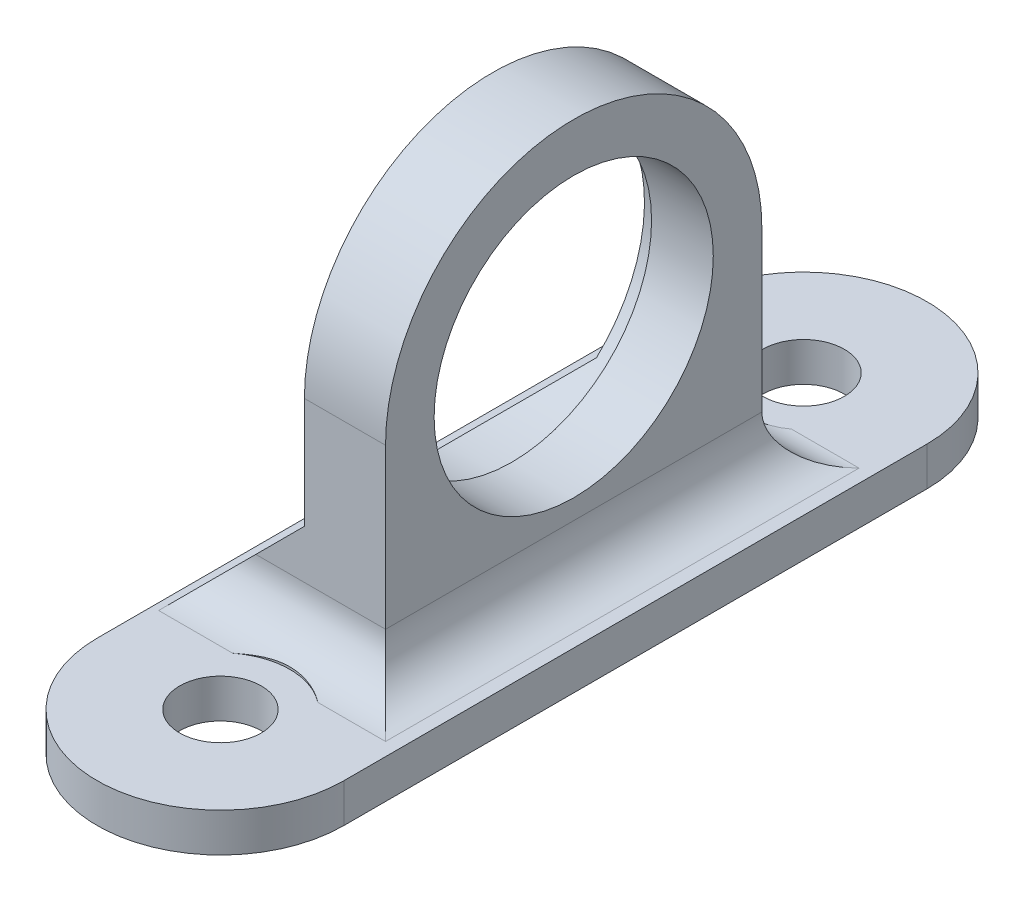
ISO-10303-21;
HEADER;
FILE_DESCRIPTION(('STEP AP214'),'2;1');
FILE_NAME('part.step','',(''),(''),'','','');
FILE_SCHEMA(('AUTOMOTIVE_DESIGN { 1 0 10303 214 1 1 1 1 }'));
ENDSEC;
DATA;
#1=APPLICATION_CONTEXT('core data for automotive mechanical design processes');
#2=APPLICATION_PROTOCOL_DEFINITION('international standard','automotive_design',2000,#1);
#3=PRODUCT_CONTEXT('',#1,'mechanical');
#4=PRODUCT('Part','Part','',(#3));
#5=PRODUCT_RELATED_PRODUCT_CATEGORY('part','',(#4));
#6=PRODUCT_DEFINITION_FORMATION('','',#4);
#7=PRODUCT_DEFINITION_CONTEXT('part definition',#1,'design');
#8=PRODUCT_DEFINITION('design','',#6,#7);
#9=PRODUCT_DEFINITION_SHAPE('','',#8);
#10=(LENGTH_UNIT() NAMED_UNIT(*) SI_UNIT(.MILLI.,.METRE.));
#11=(NAMED_UNIT(*) PLANE_ANGLE_UNIT() SI_UNIT($,.RADIAN.));
#12=(NAMED_UNIT(*) SI_UNIT($,.STERADIAN.) SOLID_ANGLE_UNIT());
#13=UNCERTAINTY_MEASURE_WITH_UNIT(LENGTH_MEASURE(1.E-05),#10,'distance_accuracy_value','');
#14=(GEOMETRIC_REPRESENTATION_CONTEXT(3) GLOBAL_UNCERTAINTY_ASSIGNED_CONTEXT((#13)) GLOBAL_UNIT_ASSIGNED_CONTEXT((#10,
#11,#12)) REPRESENTATION_CONTEXT('',''));
#15=CARTESIAN_POINT('',(0.,0.,0.));
#16=DIRECTION('',(0.,0.,1.));
#17=DIRECTION('',(1.,0.,0.));
#18=AXIS2_PLACEMENT_3D('',#15,#16,#17);
#19=CARTESIAN_POINT('',(0.,-28.4,-30.));
#20=DIRECTION('',(0.,1.,0.));
#21=DIRECTION('',(0.,0.,1.));
#22=AXIS2_PLACEMENT_3D('',#19,#20,#21);
#23=PLANE('',#22);
#24=DIRECTION('',(1.,0.,0.));
#25=VECTOR('',#24,1.);
#26=CARTESIAN_POINT('',(0.,-28.4,24.3637));
#27=LINE('',#26,#25);
#28=CARTESIAN_POINT('',(11.35,-28.4,24.3637));
#29=VERTEX_POINT('',#28);
#30=CARTESIAN_POINT('',(4.38922389181733,-28.4,24.3637));
#31=VERTEX_POINT('',#30);
#32=EDGE_CURVE('E173',#29,#31,#27,.F.);
#33=ORIENTED_EDGE('',*,*,#32,.T.);
#34=CARTESIAN_POINT('',(0.,-28.4,30.));
#35=DIRECTION('',(0.,-1.,0.));
#36=DIRECTION('',(0.,0.,-1.));
#37=AXIS2_PLACEMENT_3D('',#34,#35,#36);
#38=CIRCLE('',#37,7.14374999999999);
#39=CARTESIAN_POINT('',(-4.38922389181729,-28.4,24.3637));
#40=VERTEX_POINT('',#39);
#41=EDGE_CURVE('E81',#40,#31,#38,.T.);
#42=ORIENTED_EDGE('',*,*,#41,.F.);
#43=CARTESIAN_POINT('',(-12.0000000000001,-28.4,24.3637));
#44=VERTEX_POINT('',#43);
#45=EDGE_CURVE('E176',#40,#44,#27,.F.);
#46=ORIENTED_EDGE('',*,*,#45,.T.);
#47=DIRECTION('',(0.,0.,-1.));
#48=VECTOR('',#47,1.);
#49=CARTESIAN_POINT('',(-12.0000000000001,-28.4,-30.));
#50=LINE('',#49,#48);
#51=CARTESIAN_POINT('',(-12.0000000000001,-28.4,-24.3637));
#52=VERTEX_POINT('',#51);
#53=EDGE_CURVE('E321',#44,#52,#50,.T.);
#54=ORIENTED_EDGE('',*,*,#53,.T.);
#55=DIRECTION('',(-1.,0.,0.));
#56=VECTOR('',#55,1.);
#57=CARTESIAN_POINT('',(0.,-28.4,-24.3637));
#58=LINE('',#57,#56);
#59=CARTESIAN_POINT('',(-4.38922389181732,-28.4,-24.3637));
#60=VERTEX_POINT('',#59);
#61=EDGE_CURVE('E338',#52,#60,#58,.F.);
#62=ORIENTED_EDGE('',*,*,#61,.T.);
#63=CARTESIAN_POINT('',(0.,-28.4,-30.));
#64=DIRECTION('',(0.,-1.,0.));
#65=DIRECTION('',(0.,0.,-1.));
#66=AXIS2_PLACEMENT_3D('',#63,#64,#65);
#67=CIRCLE('',#66,7.14374999999999);
#68=CARTESIAN_POINT('',(4.38922389181732,-28.4,-24.3637));
#69=VERTEX_POINT('',#68);
#70=EDGE_CURVE('E88',#69,#60,#67,.T.);
#71=ORIENTED_EDGE('',*,*,#70,.F.);
#72=CARTESIAN_POINT('',(11.35,-28.4,-24.3637));
#73=VERTEX_POINT('',#72);
#74=EDGE_CURVE('E337',#69,#73,#58,.F.);
#75=ORIENTED_EDGE('',*,*,#74,.T.);
#76=DIRECTION('',(0.,0.,-1.));
#77=VECTOR('',#76,1.);
#78=CARTESIAN_POINT('',(11.35,-28.4,-30.));
#79=LINE('',#78,#77);
#80=EDGE_CURVE('E181',#73,#29,#79,.F.);
#81=ORIENTED_EDGE('',*,*,#80,.T.);
#82=EDGE_LOOP('',(#33,#42,#46,#54,#62,#71,#75,#81));
#83=FACE_BOUND('',#82,.T.);
#84=CARTESIAN_POINT('',(0.,-28.4,-30.));
#85=DIRECTION('',(0.,1.,0.));
#86=DIRECTION('',(0.,0.,1.));
#87=AXIS2_PLACEMENT_3D('',#84,#85,#86);
#88=CIRCLE('',#87,12.7);
#89=CARTESIAN_POINT('',(12.7,-28.4,-30.));
#90=VERTEX_POINT('',#89);
#91=CARTESIAN_POINT('',(-12.7,-28.4,-30.));
#92=VERTEX_POINT('',#91);
#93=EDGE_CURVE('E273',#90,#92,#88,.T.);
#94=ORIENTED_EDGE('',*,*,#93,.T.);
#95=DIRECTION('',(0.,0.,1.));
#96=VECTOR('',#95,1.);
#97=CARTESIAN_POINT('',(-12.7,-28.4,30.));
#98=LINE('',#97,#96);
#99=CARTESIAN_POINT('',(-12.7,-28.4,30.));
#100=VERTEX_POINT('',#99);
#101=EDGE_CURVE('E277',#92,#100,#98,.T.);
#102=ORIENTED_EDGE('',*,*,#101,.T.);
#103=CARTESIAN_POINT('',(0.,-28.4,30.));
#104=DIRECTION('',(0.,1.,0.));
#105=DIRECTION('',(0.,0.,-1.));
#106=AXIS2_PLACEMENT_3D('',#103,#104,#105);
#107=CIRCLE('',#106,12.7);
#108=CARTESIAN_POINT('',(12.7,-28.4,30.));
#109=VERTEX_POINT('',#108);
#110=EDGE_CURVE('E281',#100,#109,#107,.T.);
#111=ORIENTED_EDGE('',*,*,#110,.T.);
#112=DIRECTION('',(0.,0.,-1.));
#113=VECTOR('',#112,1.);
#114=CARTESIAN_POINT('',(12.7,-28.4,30.));
#115=LINE('',#114,#113);
#116=EDGE_CURVE('E284',#109,#90,#115,.T.);
#117=ORIENTED_EDGE('',*,*,#116,.T.);
#118=EDGE_LOOP('',(#94,#102,#111,#117));
#119=FACE_BOUND('',#118,.T.);
#120=CARTESIAN_POINT('',(0.,-28.4,-30.));
#121=DIRECTION('',(0.,1.,0.));
#122=DIRECTION('',(0.,0.,1.));
#123=AXIS2_PLACEMENT_3D('',#120,#121,#122);
#124=CIRCLE('',#123,4.2);
#125=CARTESIAN_POINT('',(0.,-28.4,-25.8));
#126=VERTEX_POINT('',#125);
#127=EDGE_CURVE('E265',#126,#126,#124,.T.);
#128=ORIENTED_EDGE('',*,*,#127,.F.);
#129=EDGE_LOOP('',(#128));
#130=FACE_BOUND('',#129,.T.);
#131=CARTESIAN_POINT('',(0.,-28.4,30.));
#132=DIRECTION('',(0.,1.,0.));
#133=DIRECTION('',(0.,0.,-1.));
#134=AXIS2_PLACEMENT_3D('',#131,#132,#133);
#135=CIRCLE('',#134,4.2);
#136=CARTESIAN_POINT('',(0.,-28.4,25.8));
#137=VERTEX_POINT('',#136);
#138=EDGE_CURVE('E257',#137,#137,#135,.T.);
#139=ORIENTED_EDGE('',*,*,#138,.F.);
#140=EDGE_LOOP('',(#139));
#141=FACE_BOUND('',#140,.T.);
#142=ADVANCED_FACE('F59',(#83,#119,#130,#141),#23,.T.);
#143=CARTESIAN_POINT('',(0.,-32.4,-30.));
#144=DIRECTION('',(0.,1.,0.));
#145=DIRECTION('',(0.,0.,1.));
#146=AXIS2_PLACEMENT_3D('',#143,#144,#145);
#147=PLANE('',#146);
#148=CARTESIAN_POINT('',(0.,-32.4,-30.));
#149=DIRECTION('',(0.,1.,0.));
#150=DIRECTION('',(0.,0.,1.));
#151=AXIS2_PLACEMENT_3D('',#148,#149,#150);
#152=CIRCLE('',#151,12.7);
#153=CARTESIAN_POINT('',(12.7,-32.4,-30.));
#154=VERTEX_POINT('',#153);
#155=CARTESIAN_POINT('',(-12.7,-32.4,-30.));
#156=VERTEX_POINT('',#155);
#157=EDGE_CURVE('E269',#154,#156,#152,.T.);
#158=ORIENTED_EDGE('',*,*,#157,.F.);
#159=DIRECTION('',(0.,0.,-1.));
#160=VECTOR('',#159,1.);
#161=CARTESIAN_POINT('',(12.7,-32.4,30.));
#162=LINE('',#161,#160);
#163=CARTESIAN_POINT('',(12.7,-32.4,30.));
#164=VERTEX_POINT('',#163);
#165=EDGE_CURVE('E278',#164,#154,#162,.T.);
#166=ORIENTED_EDGE('',*,*,#165,.F.);
#167=CARTESIAN_POINT('',(0.,-32.4,30.));
#168=DIRECTION('',(0.,1.,0.));
#169=DIRECTION('',(0.,0.,-1.));
#170=AXIS2_PLACEMENT_3D('',#167,#168,#169);
#171=CIRCLE('',#170,12.7);
#172=CARTESIAN_POINT('',(-12.7,-32.4,30.));
#173=VERTEX_POINT('',#172);
#174=EDGE_CURVE('E294',#173,#164,#171,.T.);
#175=ORIENTED_EDGE('',*,*,#174,.F.);
#176=DIRECTION('',(0.,0.,1.));
#177=VECTOR('',#176,1.);
#178=CARTESIAN_POINT('',(-12.7,-32.4,30.));
#179=LINE('',#178,#177);
#180=EDGE_CURVE('E291',#156,#173,#179,.T.);
#181=ORIENTED_EDGE('',*,*,#180,.F.);
#182=EDGE_LOOP('',(#158,#166,#175,#181));
#183=FACE_BOUND('',#182,.T.);
#184=CARTESIAN_POINT('',(0.,-32.4,-30.));
#185=DIRECTION('',(0.,1.,0.));
#186=DIRECTION('',(0.,0.,1.));
#187=AXIS2_PLACEMENT_3D('',#184,#185,#186);
#188=CIRCLE('',#187,4.2);
#189=CARTESIAN_POINT('',(0.,-32.4,-25.8));
#190=VERTEX_POINT('',#189);
#191=EDGE_CURVE('E261',#190,#190,#188,.T.);
#192=ORIENTED_EDGE('',*,*,#191,.T.);
#193=EDGE_LOOP('',(#192));
#194=FACE_BOUND('',#193,.T.);
#195=CARTESIAN_POINT('',(0.,-32.4,30.));
#196=DIRECTION('',(0.,1.,0.));
#197=DIRECTION('',(0.,0.,-1.));
#198=AXIS2_PLACEMENT_3D('',#195,#196,#197);
#199=CIRCLE('',#198,4.2);
#200=CARTESIAN_POINT('',(0.,-32.4,25.8));
#201=VERTEX_POINT('',#200);
#202=EDGE_CURVE('E253',#201,#201,#199,.T.);
#203=ORIENTED_EDGE('',*,*,#202,.T.);
#204=EDGE_LOOP('',(#203));
#205=FACE_BOUND('',#204,.T.);
#206=ADVANCED_FACE('F384',(#183,#194,#205),#147,.F.);
#207=CARTESIAN_POINT('',(0.,-28.4,-30.));
#208=DIRECTION('',(0.,-1.,0.));
#209=DIRECTION('',(0.,0.,-1.));
#210=AXIS2_PLACEMENT_3D('',#207,#208,#209);
#211=CYLINDRICAL_SURFACE('',#210,12.7);
#212=ORIENTED_EDGE('',*,*,#157,.T.);
#213=DIRECTION('',(0.,-1.,0.));
#214=VECTOR('',#213,1.);
#215=CARTESIAN_POINT('',(-12.7,-28.4,-30.));
#216=LINE('',#215,#214);
#217=EDGE_CURVE('E310',#92,#156,#216,.T.);
#218=ORIENTED_EDGE('',*,*,#217,.F.);
#219=ORIENTED_EDGE('',*,*,#93,.F.);
#220=DIRECTION('',(0.,-1.,0.));
#221=VECTOR('',#220,1.);
#222=CARTESIAN_POINT('',(12.7,-28.4,-30.));
#223=LINE('',#222,#221);
#224=EDGE_CURVE('E287',#90,#154,#223,.T.);
#225=ORIENTED_EDGE('',*,*,#224,.T.);
#226=EDGE_LOOP('',(#212,#218,#219,#225));
#227=FACE_BOUND('',#226,.T.);
#228=ADVANCED_FACE('F389',(#227),#211,.T.);
#229=CARTESIAN_POINT('',(-12.7,-28.4,30.));
#230=DIRECTION('',(1.,0.,0.));
#231=DIRECTION('',(0.,0.,-1.));
#232=AXIS2_PLACEMENT_3D('',#229,#230,#231);
#233=PLANE('',#232);
#234=ORIENTED_EDGE('',*,*,#180,.T.);
#235=DIRECTION('',(0.,-1.,0.));
#236=VECTOR('',#235,1.);
#237=CARTESIAN_POINT('',(-12.7,-28.4,30.));
#238=LINE('',#237,#236);
#239=EDGE_CURVE('E306',#100,#173,#238,.T.);
#240=ORIENTED_EDGE('',*,*,#239,.F.);
#241=ORIENTED_EDGE('',*,*,#101,.F.);
#242=ORIENTED_EDGE('',*,*,#217,.T.);
#243=EDGE_LOOP('',(#234,#240,#241,#242));
#244=FACE_BOUND('',#243,.T.);
#245=ADVANCED_FACE('F403',(#244),#233,.F.);
#246=CARTESIAN_POINT('',(0.,-28.4,30.));
#247=DIRECTION('',(0.,-1.,0.));
#248=DIRECTION('',(0.,0.,-1.));
#249=AXIS2_PLACEMENT_3D('',#246,#247,#248);
#250=CYLINDRICAL_SURFACE('',#249,12.7);
#251=ORIENTED_EDGE('',*,*,#174,.T.);
#252=DIRECTION('',(0.,-1.,0.));
#253=VECTOR('',#252,1.);
#254=CARTESIAN_POINT('',(12.7,-28.4,30.));
#255=LINE('',#254,#253);
#256=EDGE_CURVE('E302',#109,#164,#255,.T.);
#257=ORIENTED_EDGE('',*,*,#256,.F.);
#258=ORIENTED_EDGE('',*,*,#110,.F.);
#259=ORIENTED_EDGE('',*,*,#239,.T.);
#260=EDGE_LOOP('',(#251,#257,#258,#259));
#261=FACE_BOUND('',#260,.T.);
#262=ADVANCED_FACE('F399',(#261),#250,.T.);
#263=CARTESIAN_POINT('',(12.7,-28.4,30.));
#264=DIRECTION('',(-1.,0.,0.));
#265=DIRECTION('',(0.,0.,1.));
#266=AXIS2_PLACEMENT_3D('',#263,#264,#265);
#267=PLANE('',#266);
#268=ORIENTED_EDGE('',*,*,#165,.T.);
#269=ORIENTED_EDGE('',*,*,#224,.F.);
#270=ORIENTED_EDGE('',*,*,#116,.F.);
#271=ORIENTED_EDGE('',*,*,#256,.T.);
#272=EDGE_LOOP('',(#268,#269,#270,#271));
#273=FACE_BOUND('',#272,.T.);
#274=ADVANCED_FACE('F396',(#273),#267,.F.);
#275=CARTESIAN_POINT('',(0.,-28.4,-30.));
#276=DIRECTION('',(0.,-1.,0.));
#277=DIRECTION('',(0.,0.,-1.));
#278=AXIS2_PLACEMENT_3D('',#275,#276,#277);
#279=CYLINDRICAL_SURFACE('',#278,4.2);
#280=ORIENTED_EDGE('',*,*,#127,.T.);
#281=EDGE_LOOP('',(#280));
#282=FACE_BOUND('',#281,.T.);
#283=ORIENTED_EDGE('',*,*,#191,.F.);
#284=EDGE_LOOP('',(#283));
#285=FACE_BOUND('',#284,.T.);
#286=ADVANCED_FACE('F393',(#282,#285),#279,.F.);
#287=CARTESIAN_POINT('',(0.,-28.4,30.));
#288=DIRECTION('',(0.,-1.,0.));
#289=DIRECTION('',(0.,0.,-1.));
#290=AXIS2_PLACEMENT_3D('',#287,#288,#289);
#291=CYLINDRICAL_SURFACE('',#290,4.2);
#292=ORIENTED_EDGE('',*,*,#138,.T.);
#293=EDGE_LOOP('',(#292));
#294=FACE_BOUND('',#293,.T.);
#295=ORIENTED_EDGE('',*,*,#202,.F.);
#296=EDGE_LOOP('',(#295));
#297=FACE_BOUND('',#296,.T.);
#298=ADVANCED_FACE('F471',(#294,#297),#291,.F.);
#299=CARTESIAN_POINT('',(6.35,12.3657,-19.3637));
#300=DIRECTION('',(0.,0.,1.));
#301=DIRECTION('',(1.,0.,0.));
#302=AXIS2_PLACEMENT_3D('',#299,#300,#301);
#303=PLANE('',#302);
#304=DIRECTION('',(0.,-1.,0.));
#305=VECTOR('',#304,1.);
#306=CARTESIAN_POINT('',(6.35,12.3657,-19.3637));
#307=LINE('',#306,#305);
#308=CARTESIAN_POINT('',(6.35,-7.,-19.3637));
#309=VERTEX_POINT('',#308);
#310=CARTESIAN_POINT('',(6.35,-23.4,-19.3637));
#311=VERTEX_POINT('',#310);
#312=EDGE_CURVE('E237',#309,#311,#307,.T.);
#313=ORIENTED_EDGE('',*,*,#312,.T.);
#314=DIRECTION('',(-1.,0.,0.));
#315=VECTOR('',#314,1.);
#316=CARTESIAN_POINT('',(6.35,-23.4,-19.3637));
#317=LINE('',#316,#315);
#318=CARTESIAN_POINT('',(-7.00000000000012,-23.4,-19.3637));
#319=VERTEX_POINT('',#318);
#320=EDGE_CURVE('E187',#311,#319,#317,.T.);
#321=ORIENTED_EDGE('',*,*,#320,.T.);
#322=DIRECTION('',(0.707106781186544,0.707106781186551,0.));
#323=VECTOR('',#322,1.);
#324=CARTESIAN_POINT('',(17.5578499999999,1.15785000000025,-19.3637));
#325=LINE('',#324,#323);
#326=CARTESIAN_POINT('',(-2.,-18.3999999999998,-19.3637));
#327=VERTEX_POINT('',#326);
#328=EDGE_CURVE('E331',#319,#327,#325,.T.);
#329=ORIENTED_EDGE('',*,*,#328,.T.);
#330=DIRECTION('',(0.,-1.,0.));
#331=VECTOR('',#330,1.);
#332=CARTESIAN_POINT('',(-2.,12.3657,-19.3637));
#333=LINE('',#332,#331);
#334=CARTESIAN_POINT('',(-2.,-7.,-19.3637));
#335=VERTEX_POINT('',#334);
#336=EDGE_CURVE('E241',#335,#327,#333,.T.);
#337=ORIENTED_EDGE('',*,*,#336,.F.);
#338=DIRECTION('',(-1.,0.,0.));
#339=VECTOR('',#338,1.);
#340=CARTESIAN_POINT('',(6.35,-7.,-19.3637));
#341=LINE('',#340,#339);
#342=EDGE_CURVE('E234',#335,#309,#341,.F.);
#343=ORIENTED_EDGE('',*,*,#342,.T.);
#344=EDGE_LOOP('',(#313,#321,#329,#337,#343));
#345=FACE_BOUND('',#344,.T.);
#346=ADVANCED_FACE('F464',(#345),#303,.F.);
#347=CARTESIAN_POINT('',(6.35,12.3657,19.3637));
#348=DIRECTION('',(-1.,0.,0.));
#349=DIRECTION('',(0.,0.,1.));
#350=AXIS2_PLACEMENT_3D('',#347,#348,#349);
#351=PLANE('',#350);
#352=DIRECTION('',(0.,-1.,0.));
#353=VECTOR('',#352,1.);
#354=CARTESIAN_POINT('',(6.35,12.3657,19.3637));
#355=LINE('',#354,#353);
#356=CARTESIAN_POINT('',(6.35,-7.,19.3637));
#357=VERTEX_POINT('',#356);
#358=CARTESIAN_POINT('',(6.35,-23.4,19.3637));
#359=VERTEX_POINT('',#358);
#360=EDGE_CURVE('E249',#357,#359,#355,.T.);
#361=ORIENTED_EDGE('',*,*,#360,.T.);
#362=DIRECTION('',(0.,0.,-1.));
#363=VECTOR('',#362,1.);
#364=CARTESIAN_POINT('',(6.35,-23.4,19.3637));
#365=LINE('',#364,#363);
#366=EDGE_CURVE('E183',#359,#311,#365,.T.);
#367=ORIENTED_EDGE('',*,*,#366,.T.);
#368=ORIENTED_EDGE('',*,*,#312,.F.);
#369=CARTESIAN_POINT('',(6.35,-7.,0.));
#370=DIRECTION('',(1.,0.,0.));
#371=DIRECTION('',(0.,0.,-1.));
#372=AXIS2_PLACEMENT_3D('',#369,#370,#371);
#373=CIRCLE('',#372,19.3637);
#374=EDGE_CURVE('E225',#309,#357,#373,.T.);
#375=ORIENTED_EDGE('',*,*,#374,.T.);
#376=EDGE_LOOP('',(#361,#367,#368,#375));
#377=FACE_BOUND('',#376,.T.);
#378=CARTESIAN_POINT('',(6.35,-7.,0.));
#379=DIRECTION('',(1.,0.,0.));
#380=DIRECTION('',(0.,0.,-1.));
#381=AXIS2_PLACEMENT_3D('',#378,#379,#380);
#382=CIRCLE('',#381,14.3637);
#383=CARTESIAN_POINT('',(6.35,-7.,-14.3637));
#384=VERTEX_POINT('',#383);
#385=EDGE_CURVE('E221',#384,#384,#382,.T.);
#386=ORIENTED_EDGE('',*,*,#385,.F.);
#387=EDGE_LOOP('',(#386));
#388=FACE_BOUND('',#387,.T.);
#389=ADVANCED_FACE('F354',(#377,#388),#351,.F.);
#390=CARTESIAN_POINT('',(-2.,12.3657,-19.3637));
#391=DIRECTION('',(1.,0.,0.));
#392=DIRECTION('',(0.,0.,-1.));
#393=AXIS2_PLACEMENT_3D('',#390,#391,#392);
#394=PLANE('',#393);
#395=ORIENTED_EDGE('',*,*,#336,.T.);
#396=DIRECTION('',(0.,0.,1.));
#397=VECTOR('',#396,1.);
#398=CARTESIAN_POINT('',(-2.,-18.3999999999998,-19.3637));
#399=LINE('',#398,#397);
#400=CARTESIAN_POINT('',(-2.,-18.3999999999998,-10.6982510575329));
#401=VERTEX_POINT('',#400);
#402=EDGE_CURVE('E317',#327,#401,#399,.T.);
#403=ORIENTED_EDGE('',*,*,#402,.T.);
#404=CARTESIAN_POINT('',(-2.,-7.,0.));
#405=DIRECTION('',(-1.,0.,0.));
#406=DIRECTION('',(0.,0.,1.));
#407=AXIS2_PLACEMENT_3D('',#404,#405,#406);
#408=CIRCLE('',#407,15.6337);
#409=CARTESIAN_POINT('',(-2.,-18.3999999999998,10.6982510575329));
#410=VERTEX_POINT('',#409);
#411=EDGE_CURVE('E211',#410,#401,#408,.T.);
#412=ORIENTED_EDGE('',*,*,#411,.F.);
#413=DIRECTION('',(0.,0.,1.));
#414=VECTOR('',#413,1.);
#415=CARTESIAN_POINT('',(-2.,-18.3999999999998,-19.3637));
#416=LINE('',#415,#414);
#417=CARTESIAN_POINT('',(-2.,-18.3999999999998,19.3637));
#418=VERTEX_POINT('',#417);
#419=EDGE_CURVE('E314',#410,#418,#416,.T.);
#420=ORIENTED_EDGE('',*,*,#419,.T.);
#421=DIRECTION('',(0.,-1.,0.));
#422=VECTOR('',#421,1.);
#423=CARTESIAN_POINT('',(-2.,12.3657,19.3637));
#424=LINE('',#423,#422);
#425=CARTESIAN_POINT('',(-2.,-7.,19.3637));
#426=VERTEX_POINT('',#425);
#427=EDGE_CURVE('E245',#426,#418,#424,.T.);
#428=ORIENTED_EDGE('',*,*,#427,.F.);
#429=CARTESIAN_POINT('',(-2.,-7.,0.));
#430=DIRECTION('',(-1.,0.,0.));
#431=DIRECTION('',(0.,0.,1.));
#432=AXIS2_PLACEMENT_3D('',#429,#430,#431);
#433=CIRCLE('',#432,19.3637);
#434=EDGE_CURVE('E217',#426,#335,#433,.T.);
#435=ORIENTED_EDGE('',*,*,#434,.T.);
#436=EDGE_LOOP('',(#395,#403,#412,#420,#428,#435));
#437=FACE_BOUND('',#436,.T.);
#438=ADVANCED_FACE('F365',(#437),#394,.F.);
#439=CARTESIAN_POINT('',(-2.,12.3657,19.3637));
#440=DIRECTION('',(0.,0.,-1.));
#441=DIRECTION('',(-1.,0.,0.));
#442=AXIS2_PLACEMENT_3D('',#439,#440,#441);
#443=PLANE('',#442);
#444=DIRECTION('',(-0.707106781186544,-0.707106781186551,0.));
#445=VECTOR('',#444,1.);
#446=CARTESIAN_POINT('',(13.3828499999999,-3.01714999999975,19.3637));
#447=LINE('',#446,#445);
#448=CARTESIAN_POINT('',(-7.00000000000012,-23.4,19.3637));
#449=VERTEX_POINT('',#448);
#450=EDGE_CURVE('E327',#418,#449,#447,.T.);
#451=ORIENTED_EDGE('',*,*,#450,.T.);
#452=DIRECTION('',(1.,0.,0.));
#453=VECTOR('',#452,1.);
#454=CARTESIAN_POINT('',(-2.,-23.4,19.3637));
#455=LINE('',#454,#453);
#456=EDGE_CURVE('E334',#449,#359,#455,.T.);
#457=ORIENTED_EDGE('',*,*,#456,.T.);
#458=ORIENTED_EDGE('',*,*,#360,.F.);
#459=DIRECTION('',(-1.,0.,0.));
#460=VECTOR('',#459,1.);
#461=CARTESIAN_POINT('',(6.35,-7.,19.3637));
#462=LINE('',#461,#460);
#463=EDGE_CURVE('E230',#426,#357,#462,.F.);
#464=ORIENTED_EDGE('',*,*,#463,.F.);
#465=ORIENTED_EDGE('',*,*,#427,.T.);
#466=EDGE_LOOP('',(#451,#457,#458,#464,#465));
#467=FACE_BOUND('',#466,.T.);
#468=ADVANCED_FACE('F351',(#467),#443,.F.);
#469=CARTESIAN_POINT('',(0.,0.,0.));
#470=DIRECTION('',(1.,0.,0.));
#471=DIRECTION('',(0.,0.,-1.));
#472=AXIS2_PLACEMENT_3D('',#469,#470,#471);
#473=PLANE('',#472);
#474=CARTESIAN_POINT('',(0.,-7.,0.));
#475=DIRECTION('',(1.,0.,0.));
#476=DIRECTION('',(0.,0.,-1.));
#477=AXIS2_PLACEMENT_3D('',#474,#475,#476);
#478=CIRCLE('',#477,14.3637);
#479=CARTESIAN_POINT('',(0.,-7.,-14.3637));
#480=VERTEX_POINT('',#479);
#481=EDGE_CURVE('E226',#480,#480,#478,.T.);
#482=ORIENTED_EDGE('',*,*,#481,.T.);
#483=EDGE_LOOP('',(#482));
#484=FACE_BOUND('',#483,.T.);
#485=CARTESIAN_POINT('',(0.,-7.,0.));
#486=DIRECTION('',(-1.,0.,0.));
#487=DIRECTION('',(0.,0.,1.));
#488=AXIS2_PLACEMENT_3D('',#485,#486,#487);
#489=CIRCLE('',#488,15.6337);
#490=CARTESIAN_POINT('',(0.,-7.,15.6337));
#491=VERTEX_POINT('',#490);
#492=EDGE_CURVE('E205',#491,#491,#489,.T.);
#493=ORIENTED_EDGE('',*,*,#492,.T.);
#494=EDGE_LOOP('',(#493));
#495=FACE_BOUND('',#494,.T.);
#496=ADVANCED_FACE('F454',(#484,#495),#473,.F.);
#497=CARTESIAN_POINT('',(6.35,-7.,0.));
#498=DIRECTION('',(-1.,0.,0.));
#499=DIRECTION('',(0.,0.,1.));
#500=AXIS2_PLACEMENT_3D('',#497,#498,#499);
#501=CYLINDRICAL_SURFACE('',#500,14.3637);
#502=ORIENTED_EDGE('',*,*,#385,.T.);
#503=EDGE_LOOP('',(#502));
#504=FACE_BOUND('',#503,.T.);
#505=ORIENTED_EDGE('',*,*,#481,.F.);
#506=EDGE_LOOP('',(#505));
#507=FACE_BOUND('',#506,.T.);
#508=ADVANCED_FACE('F447',(#504,#507),#501,.F.);
#509=CARTESIAN_POINT('',(6.35,-7.,0.));
#510=DIRECTION('',(-1.,0.,0.));
#511=DIRECTION('',(0.,0.,1.));
#512=AXIS2_PLACEMENT_3D('',#509,#510,#511);
#513=CYLINDRICAL_SURFACE('',#512,19.3637);
#514=ORIENTED_EDGE('',*,*,#342,.F.);
#515=ORIENTED_EDGE('',*,*,#434,.F.);
#516=ORIENTED_EDGE('',*,*,#463,.T.);
#517=ORIENTED_EDGE('',*,*,#374,.F.);
#518=EDGE_LOOP('',(#514,#515,#516,#517));
#519=FACE_BOUND('',#518,.T.);
#520=ADVANCED_FACE('F360',(#519),#513,.T.);
#521=CARTESIAN_POINT('',(-2.,-7.,0.));
#522=DIRECTION('',(1.,0.,0.));
#523=DIRECTION('',(0.,0.,-1.));
#524=AXIS2_PLACEMENT_3D('',#521,#522,#523);
#525=CYLINDRICAL_SURFACE('',#524,15.6337);
#526=ORIENTED_EDGE('',*,*,#411,.T.);
#527=CARTESIAN_POINT('',(9.39999999999971,-7.,0.));
#528=DIRECTION('',(0.707106781186551,-0.707106781186544,0.));
#529=DIRECTION('',(0.707106781186544,0.707106781186551,0.));
#530=AXIS2_PLACEMENT_3D('',#527,#528,#529);
#531=ELLIPSE('',#530,22.1093905700721,15.6337);
#532=EDGE_CURVE('E324',#401,#410,#531,.F.);
#533=ORIENTED_EDGE('',*,*,#532,.T.);
#534=EDGE_LOOP('',(#526,#533));
#535=FACE_BOUND('',#534,.T.);
#536=ORIENTED_EDGE('',*,*,#492,.F.);
#537=EDGE_LOOP('',(#536));
#538=FACE_BOUND('',#537,.T.);
#539=ADVANCED_FACE('F412',(#535,#538),#525,.F.);
#540=CARTESIAN_POINT('',(-2.,-18.3999999999998,-19.3637));
#541=DIRECTION('',(0.707106781186551,-0.707106781186544,0.));
#542=DIRECTION('',(0.,0.,1.));
#543=AXIS2_PLACEMENT_3D('',#540,#541,#542);
#544=PLANE('',#543);
#545=ORIENTED_EDGE('',*,*,#328,.F.);
#546=CARTESIAN_POINT('',(-7.00000000000012,-23.4,-24.3637));
#547=DIRECTION('',(0.707106781186551,-0.707106781186544,0.));
#548=DIRECTION('',(-0.707106781186544,-0.707106781186551,0.));
#549=AXIS2_PLACEMENT_3D('',#546,#547,#548);
#550=ELLIPSE('',#549,7.07106781186544,5.);
#551=EDGE_CURVE('E74',#319,#52,#550,.T.);
#552=ORIENTED_EDGE('',*,*,#551,.T.);
#553=ORIENTED_EDGE('',*,*,#53,.F.);
#554=CARTESIAN_POINT('',(-7.00000000000012,-23.4,24.3637));
#555=DIRECTION('',(0.707106781186551,-0.707106781186544,0.));
#556=DIRECTION('',(0.707106781186544,0.707106781186551,0.));
#557=AXIS2_PLACEMENT_3D('',#554,#555,#556);
#558=ELLIPSE('',#557,7.07106781186544,5.);
#559=EDGE_CURVE('E194',#44,#449,#558,.T.);
#560=ORIENTED_EDGE('',*,*,#559,.T.);
#561=ORIENTED_EDGE('',*,*,#450,.F.);
#562=ORIENTED_EDGE('',*,*,#419,.F.);
#563=ORIENTED_EDGE('',*,*,#532,.F.);
#564=ORIENTED_EDGE('',*,*,#402,.F.);
#565=EDGE_LOOP('',(#545,#552,#553,#560,#561,#562,#563,#564));
#566=FACE_BOUND('',#565,.T.);
#567=ADVANCED_FACE('F370',(#566),#544,.F.);
#568=CARTESIAN_POINT('',(6.35,-23.4,-24.3637));
#569=DIRECTION('',(-1.,0.,0.));
#570=DIRECTION('',(0.,0.,1.));
#571=AXIS2_PLACEMENT_3D('',#568,#569,#570);
#572=CYLINDRICAL_SURFACE('',#571,5.);
#573=ORIENTED_EDGE('',*,*,#74,.F.);
#574=CARTESIAN_POINT('',(4.38922389181732,-28.4,-24.3637));
#575=CARTESIAN_POINT('',(4.22095040871951,-28.3999535789511,-24.2326218956721));
#576=CARTESIAN_POINT('',(4.04687842767492,-28.3948464913357,-24.1092071201147));
#577=CARTESIAN_POINT('',(3.688749634505,-28.3777663108875,-23.8786026177491));
#578=CARTESIAN_POINT('',(3.50469909003857,-28.3657974837795,-23.771402862859));
#579=CARTESIAN_POINT('',(3.12785767379294,-28.3382296883527,-23.573880738536));
#580=CARTESIAN_POINT('',(2.93505973651786,-28.3226277418742,-23.483572325473));
#581=CARTESIAN_POINT('',(2.5422144047366,-28.2906727474965,-23.3205145105911));
#582=CARTESIAN_POINT('',(2.34216650315234,-28.2743196470384,-23.2477663397099));
#583=CARTESIAN_POINT('',(1.95230458568164,-28.2446121563891,-23.1254051297436));
#584=CARTESIAN_POINT('',(1.76293092943569,-28.231122921237,-23.0744182527256));
#585=CARTESIAN_POINT('',(1.3804547695671,-28.2072749764116,-22.9881579322524));
#586=CARTESIAN_POINT('',(1.18735270812705,-28.1969158979039,-22.9528826372287));
#587=CARTESIAN_POINT('',(0.799070043661612,-28.1805488713506,-22.8983795732748));
#588=CARTESIAN_POINT('',(0.603893900339781,-28.1745329810406,-22.8791225024071));
#589=CARTESIAN_POINT('',(0.212524073600198,-28.16751075586,-22.856722494866));
#590=CARTESIAN_POINT('',(0.0163303860525848,-28.1665044413375,-22.8535796236459));
#591=CARTESIAN_POINT('',(-0.374799180223943,-28.1696099411795,-22.8634179953213));
#592=CARTESIAN_POINT('',(-0.569736909259591,-28.1737006632693,-22.87633278881));
#593=CARTESIAN_POINT('',(-0.957747965232023,-28.1864998373551,-22.9180540175156));
#594=CARTESIAN_POINT('',(-1.15082126415814,-28.1952083586179,-22.9468606911109));
#595=CARTESIAN_POINT('',(-1.53406586094001,-28.2162638839969,-23.0201767748977));
#596=CARTESIAN_POINT('',(-1.72423214992497,-28.2286165551995,-23.0647106641989));
#597=CARTESIAN_POINT('',(-2.10014089677376,-28.2555054516432,-23.1691414704829));
#598=CARTESIAN_POINT('',(-2.28588325066979,-28.2700417281431,-23.2290387481352));
#599=CARTESIAN_POINT('',(-2.64125865637564,-28.2986368438278,-23.3599189686805));
#600=CARTESIAN_POINT('',(-2.81120294772532,-28.3126748633913,-23.4300632691819));
#601=CARTESIAN_POINT('',(-3.14524373626635,-28.3393295136834,-23.5832743747507));
#602=CARTESIAN_POINT('',(-3.30934138608745,-28.3519464256468,-23.6663386152107));
#603=CARTESIAN_POINT('',(-3.63057110489196,-28.3738202127712,-23.844855555895));
#604=CARTESIAN_POINT('',(-3.78771377144523,-28.3830823661203,-23.9402884718409));
#605=CARTESIAN_POINT('',(-4.09442566350405,-28.3961615091439,-24.1431459877537));
#606=CARTESIAN_POINT('',(-4.24399005723318,-28.399975065996,-24.2505781017609));
#607=CARTESIAN_POINT('',(-4.38922389181732,-28.4,-24.3637));
#608=B_SPLINE_CURVE_WITH_KNOTS('',3,(#574,#575,#576,#577,#578,#579,#580,#581,#582,#583,#584,
#585,#586,#587,#588,#589,#590,#591,#592,#593,#594,#595,#596,#597,#598,#599,#600,#601,#602,#603,
#604,#605,#606,#607),.UNSPECIFIED.,.F.,.F.,(4,2,2,2,2,2,2,2,2,2,2,2,2,2,2,2,4),(0.,
0.639444100482189,1.27849110934208,1.9180638167697,2.55768134394549,3.14675898342886,
3.73576718328748,4.32369553340466,4.91162627159066,5.49713212731672,6.08264676587373,
6.66907679280505,7.25552058797794,7.80814012898238,8.36065011470234,8.91228699705255,
9.46427127851432),.UNSPECIFIED.);
#609=EDGE_CURVE('E12',#69,#60,#608,.T.);
#610=ORIENTED_EDGE('',*,*,#609,.T.);
#611=ORIENTED_EDGE('',*,*,#61,.F.);
#612=ORIENTED_EDGE('',*,*,#551,.F.);
#613=ORIENTED_EDGE('',*,*,#320,.F.);
#614=CARTESIAN_POINT('',(11.35,-23.4,-24.3637));
#615=DIRECTION('',(-0.707106781186547,0.,-0.707106781186547));
#616=DIRECTION('',(-0.707106781186547,0.,0.707106781186547));
#617=AXIS2_PLACEMENT_3D('',#614,#615,#616);
#618=ELLIPSE('',#617,7.07106781186547,5.);
#619=EDGE_CURVE('E202',#73,#311,#618,.T.);
#620=ORIENTED_EDGE('',*,*,#619,.F.);
#621=EDGE_LOOP('',(#573,#610,#611,#612,#613,#620));
#622=FACE_BOUND('',#621,.T.);
#623=ADVANCED_FACE('F61',(#622),#572,.F.);
#624=CARTESIAN_POINT('',(11.35,-23.4,19.3637));
#625=DIRECTION('',(0.,0.,-1.));
#626=DIRECTION('',(-1.,0.,0.));
#627=AXIS2_PLACEMENT_3D('',#624,#625,#626);
#628=CYLINDRICAL_SURFACE('',#627,5.);
#629=ORIENTED_EDGE('',*,*,#619,.T.);
#630=ORIENTED_EDGE('',*,*,#366,.F.);
#631=CARTESIAN_POINT('',(11.35,-23.4,24.3637));
#632=DIRECTION('',(0.707106781186547,0.,-0.707106781186547));
#633=DIRECTION('',(-0.707106781186547,0.,-0.707106781186547));
#634=AXIS2_PLACEMENT_3D('',#631,#632,#633);
#635=ELLIPSE('',#634,7.07106781186547,5.);
#636=EDGE_CURVE('E200',#29,#359,#635,.T.);
#637=ORIENTED_EDGE('',*,*,#636,.F.);
#638=ORIENTED_EDGE('',*,*,#80,.F.);
#639=EDGE_LOOP('',(#629,#630,#637,#638));
#640=FACE_BOUND('',#639,.T.);
#641=ADVANCED_FACE('F348',(#640),#628,.F.);
#642=CARTESIAN_POINT('',(-2.,-23.4,24.3637));
#643=DIRECTION('',(1.,0.,0.));
#644=DIRECTION('',(0.,0.,-1.));
#645=AXIS2_PLACEMENT_3D('',#642,#643,#644);
#646=CYLINDRICAL_SURFACE('',#645,5.);
#647=ORIENTED_EDGE('',*,*,#45,.F.);
#648=CARTESIAN_POINT('',(-4.3892238918173,-28.4,24.3637));
#649=CARTESIAN_POINT('',(-4.22095040871949,-28.3999535789511,24.2326218956721));
#650=CARTESIAN_POINT('',(-4.04687842767491,-28.3948464913357,24.1092071201147));
#651=CARTESIAN_POINT('',(-3.68874963450498,-28.3777663108875,23.8786026177491));
#652=CARTESIAN_POINT('',(-3.50469909003855,-28.3657974837795,23.771402862859));
#653=CARTESIAN_POINT('',(-3.12785767379292,-28.3382296883527,23.573880738536));
#654=CARTESIAN_POINT('',(-2.93505973651784,-28.3226277418742,23.483572325473));
#655=CARTESIAN_POINT('',(-2.54221440473658,-28.2906727474965,23.3205145105911));
#656=CARTESIAN_POINT('',(-2.34216650315232,-28.2743196470384,23.2477663397099));
#657=CARTESIAN_POINT('',(-1.95230458568163,-28.2446121563891,23.1254051297436));
#658=CARTESIAN_POINT('',(-1.76293092943567,-28.231122921237,23.0744182527256));
#659=CARTESIAN_POINT('',(-1.38045476956708,-28.2072749764116,22.9881579322524));
#660=CARTESIAN_POINT('',(-1.18735270812704,-28.1969158979039,22.9528826372287));
#661=CARTESIAN_POINT('',(-0.799070043661593,-28.1805488713506,22.8983795732748));
#662=CARTESIAN_POINT('',(-0.603893900339762,-28.1745329810406,22.8791225024071));
#663=CARTESIAN_POINT('',(-0.212524073600179,-28.16751075586,22.856722494866));
#664=CARTESIAN_POINT('',(-0.0163303860525658,-28.1665044413375,22.8535796236459));
#665=CARTESIAN_POINT('',(0.374799180223962,-28.1696099411795,22.8634179953213));
#666=CARTESIAN_POINT('',(0.56973690925961,-28.1737006632693,22.87633278881));
#667=CARTESIAN_POINT('',(0.957747965232042,-28.1864998373551,22.9180540175156));
#668=CARTESIAN_POINT('',(1.15082126415816,-28.1952083586179,22.9468606911109));
#669=CARTESIAN_POINT('',(1.53406586094003,-28.2162638839969,23.0201767748977));
#670=CARTESIAN_POINT('',(1.72423214992499,-28.2286165551995,23.0647106641989));
#671=CARTESIAN_POINT('',(2.10014089677378,-28.2555054516432,23.1691414704829));
#672=CARTESIAN_POINT('',(2.28588325066981,-28.2700417281431,23.2290387481352));
#673=CARTESIAN_POINT('',(2.64125865637566,-28.2986368438278,23.3599189686805));
#674=CARTESIAN_POINT('',(2.81120294772534,-28.3126748633913,23.4300632691819));
#675=CARTESIAN_POINT('',(3.14524373626637,-28.3393295136834,23.5832743747507));
#676=CARTESIAN_POINT('',(3.30934138608747,-28.3519464256468,23.6663386152107));
#677=CARTESIAN_POINT('',(3.63057110489198,-28.3738202127712,23.844855555895));
#678=CARTESIAN_POINT('',(3.78771377144525,-28.3830823661203,23.9402884718409));
#679=CARTESIAN_POINT('',(4.09442566350407,-28.3961615091439,24.1431459877537));
#680=CARTESIAN_POINT('',(4.2439900572332,-28.399975065996,24.2505781017609));
#681=CARTESIAN_POINT('',(4.38922389181733,-28.4,24.3637));
#682=B_SPLINE_CURVE_WITH_KNOTS('',3,(#648,#649,#650,#651,#652,#653,#654,#655,#656,#657,#658,
#659,#660,#661,#662,#663,#664,#665,#666,#667,#668,#669,#670,#671,#672,#673,#674,#675,#676,#677,
#678,#679,#680,#681),.UNSPECIFIED.,.F.,.F.,(4,2,2,2,2,2,2,2,2,2,2,2,2,2,2,2,4),(0.,
0.639444100482189,1.27849110934208,1.9180638167697,2.55768134394549,3.14675898342886,
3.73576718328748,4.32369553340466,4.91162627159066,5.49713212731672,6.08264676587373,
6.66907679280505,7.25552058797794,7.80814012898238,8.36065011470234,8.91228699705255,
9.46427127851432),.UNSPECIFIED.);
#683=EDGE_CURVE('E166',#40,#31,#682,.T.);
#684=ORIENTED_EDGE('',*,*,#683,.T.);
#685=ORIENTED_EDGE('',*,*,#32,.F.);
#686=ORIENTED_EDGE('',*,*,#636,.T.);
#687=ORIENTED_EDGE('',*,*,#456,.F.);
#688=ORIENTED_EDGE('',*,*,#559,.F.);
#689=EDGE_LOOP('',(#647,#684,#685,#686,#687,#688));
#690=FACE_BOUND('',#689,.T.);
#691=ADVANCED_FACE('F172',(#690),#646,.F.);
#692=CARTESIAN_POINT('',(0.,-28.4,-30.));
#693=DIRECTION('',(0.,-1.,0.));
#694=DIRECTION('',(0.,0.,-1.));
#695=AXIS2_PLACEMENT_3D('',#692,#693,#694);
#696=CYLINDRICAL_SURFACE('',#695,7.14374999999999);
#697=ORIENTED_EDGE('',*,*,#70,.T.);
#698=ORIENTED_EDGE('',*,*,#609,.F.);
#699=EDGE_LOOP('',(#697,#698));
#700=FACE_BOUND('',#699,.T.);
#701=ADVANCED_FACE('F373',(#700),#696,.F.);
#702=CARTESIAN_POINT('',(0.,-28.4,30.));
#703=DIRECTION('',(0.,-1.,0.));
#704=DIRECTION('',(0.,0.,-1.));
#705=AXIS2_PLACEMENT_3D('',#702,#703,#704);
#706=CYLINDRICAL_SURFACE('',#705,7.14374999999999);
#707=ORIENTED_EDGE('',*,*,#41,.T.);
#708=ORIENTED_EDGE('',*,*,#683,.F.);
#709=EDGE_LOOP('',(#707,#708));
#710=FACE_BOUND('',#709,.T.);
#711=ADVANCED_FACE('F165',(#710),#706,.F.);
#712=CLOSED_SHELL('',(#142,#206,#228,#245,#262,#274,#286,#298,#346,#389,#438,#468,#496,#508,
#520,#539,#567,#623,#641,#691,#701,#711));
#713=MANIFOLD_SOLID_BREP('B2',#712);
#714=ADVANCED_BREP_SHAPE_REPRESENTATION('',(#18,#713),#14);
#715=SHAPE_DEFINITION_REPRESENTATION(#9,#714);
ENDSEC;
END-ISO-10303-21;
